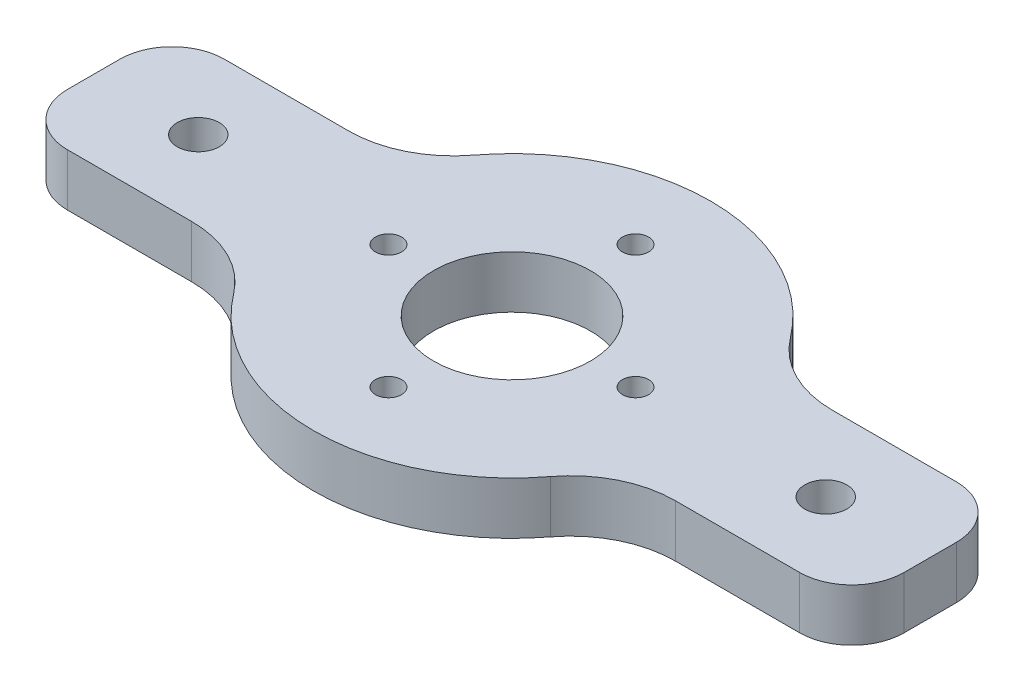
ISO-10303-21;
HEADER;
FILE_DESCRIPTION(('STEP AP214'),'2;1');
FILE_NAME('part.step','',(''),(''),'','','');
FILE_SCHEMA(('AUTOMOTIVE_DESIGN { 1 0 10303 214 1 1 1 1 }'));
ENDSEC;
DATA;
#1=APPLICATION_CONTEXT('core data for automotive mechanical design processes');
#2=APPLICATION_PROTOCOL_DEFINITION('international standard','automotive_design',2000,#1);
#3=PRODUCT_CONTEXT('',#1,'mechanical');
#4=PRODUCT('Part','Part','',(#3));
#5=PRODUCT_RELATED_PRODUCT_CATEGORY('part','',(#4));
#6=PRODUCT_DEFINITION_FORMATION('','',#4);
#7=PRODUCT_DEFINITION_CONTEXT('part definition',#1,'design');
#8=PRODUCT_DEFINITION('design','',#6,#7);
#9=PRODUCT_DEFINITION_SHAPE('','',#8);
#10=(LENGTH_UNIT() NAMED_UNIT(*) SI_UNIT(.MILLI.,.METRE.));
#11=(NAMED_UNIT(*) PLANE_ANGLE_UNIT() SI_UNIT($,.RADIAN.));
#12=(NAMED_UNIT(*) SI_UNIT($,.STERADIAN.) SOLID_ANGLE_UNIT());
#13=UNCERTAINTY_MEASURE_WITH_UNIT(LENGTH_MEASURE(1.E-05),#10,'distance_accuracy_value','');
#14=(GEOMETRIC_REPRESENTATION_CONTEXT(3) GLOBAL_UNCERTAINTY_ASSIGNED_CONTEXT((#13)) GLOBAL_UNIT_ASSIGNED_CONTEXT((#10,
#11,#12)) REPRESENTATION_CONTEXT('',''));
#15=CARTESIAN_POINT('',(0.,0.,0.));
#16=DIRECTION('',(0.,0.,1.));
#17=DIRECTION('',(1.,0.,0.));
#18=AXIS2_PLACEMENT_3D('',#15,#16,#17);
#19=CARTESIAN_POINT('',(0.,6.35,-9.525));
#20=DIRECTION('',(0.,0.,-1.));
#21=DIRECTION('',(-1.,0.,0.));
#22=AXIS2_PLACEMENT_3D('',#19,#20,#21);
#23=PLANE('',#22);
#24=DIRECTION('',(1.,0.,0.));
#25=VECTOR('',#24,1.);
#26=CARTESIAN_POINT('',(0.,0.,-9.525));
#27=LINE('',#26,#25);
#28=CARTESIAN_POINT('',(29.3683209428118,0.,-9.525));
#29=VERTEX_POINT('',#28);
#30=CARTESIAN_POINT('',(44.4499999999999,0.,-9.525));
#31=VERTEX_POINT('',#30);
#32=EDGE_CURVE('E220',#29,#31,#27,.T.);
#33=ORIENTED_EDGE('',*,*,#32,.F.);
#34=DIRECTION('',(0.,-1.,0.));
#35=VECTOR('',#34,1.);
#36=CARTESIAN_POINT('',(29.3683209428118,6.35,-9.525));
#37=LINE('',#36,#35);
#38=CARTESIAN_POINT('',(29.3683209428118,6.35,-9.525));
#39=VERTEX_POINT('',#38);
#40=EDGE_CURVE('E11',#39,#29,#37,.T.);
#41=ORIENTED_EDGE('',*,*,#40,.F.);
#42=DIRECTION('',(1.,0.,0.));
#43=VECTOR('',#42,1.);
#44=CARTESIAN_POINT('',(0.,6.35,-9.525));
#45=LINE('',#44,#43);
#46=CARTESIAN_POINT('',(44.4499999999999,6.35,-9.525));
#47=VERTEX_POINT('',#46);
#48=EDGE_CURVE('E303',#39,#47,#45,.T.);
#49=ORIENTED_EDGE('',*,*,#48,.T.);
#50=DIRECTION('',(0.,-1.,0.));
#51=VECTOR('',#50,1.);
#52=CARTESIAN_POINT('',(44.4499999999999,6.35,-9.525));
#53=LINE('',#52,#51);
#54=EDGE_CURVE('E60',#47,#31,#53,.T.);
#55=ORIENTED_EDGE('',*,*,#54,.T.);
#56=EDGE_LOOP('',(#33,#41,#49,#55));
#57=FACE_BOUND('',#56,.T.);
#58=ADVANCED_FACE('F43',(#57),#23,.T.);
#59=CARTESIAN_POINT('',(29.3683209428118,6.35,-22.225));
#60=DIRECTION('',(0.,-1.,0.));
#61=DIRECTION('',(0.,0.,-1.));
#62=AXIS2_PLACEMENT_3D('',#59,#60,#61);
#63=CYLINDRICAL_SURFACE('',#62,12.7);
#64=CARTESIAN_POINT('',(29.3683209428118,0.,-22.225));
#65=DIRECTION('',(0.,1.,0.));
#66=DIRECTION('',(0.,0.,1.));
#67=AXIS2_PLACEMENT_3D('',#64,#65,#66);
#68=CIRCLE('',#67,12.7);
#69=CARTESIAN_POINT('',(19.2413137211526,0.,-14.5612068965517));
#70=VERTEX_POINT('',#69);
#71=EDGE_CURVE('E223',#29,#70,#68,.F.);
#72=ORIENTED_EDGE('',*,*,#71,.T.);
#73=DIRECTION('',(0.,-1.,0.));
#74=VECTOR('',#73,1.);
#75=CARTESIAN_POINT('',(19.2413137211526,6.35,-14.5612068965517));
#76=LINE('',#75,#74);
#77=CARTESIAN_POINT('',(19.2413137211526,6.35,-14.5612068965517));
#78=VERTEX_POINT('',#77);
#79=EDGE_CURVE('E52',#78,#70,#76,.T.);
#80=ORIENTED_EDGE('',*,*,#79,.F.);
#81=CARTESIAN_POINT('',(29.3683209428118,6.35,-22.225));
#82=DIRECTION('',(0.,1.,0.));
#83=DIRECTION('',(0.,0.,1.));
#84=AXIS2_PLACEMENT_3D('',#81,#82,#83);
#85=CIRCLE('',#84,12.7);
#86=EDGE_CURVE('E373',#39,#78,#85,.F.);
#87=ORIENTED_EDGE('',*,*,#86,.F.);
#88=ORIENTED_EDGE('',*,*,#40,.T.);
#89=EDGE_LOOP('',(#72,#80,#87,#88));
#90=FACE_BOUND('',#89,.T.);
#91=ADVANCED_FACE('F422',(#90),#63,.F.);
#92=CARTESIAN_POINT('',(0.,6.35,0.));
#93=DIRECTION('',(0.,-1.,0.));
#94=DIRECTION('',(0.,0.,-1.));
#95=AXIS2_PLACEMENT_3D('',#92,#93,#94);
#96=CYLINDRICAL_SURFACE('',#95,24.13);
#97=CARTESIAN_POINT('',(0.,0.,0.));
#98=DIRECTION('',(0.,1.,0.));
#99=DIRECTION('',(0.,0.,1.));
#100=AXIS2_PLACEMENT_3D('',#97,#98,#99);
#101=CIRCLE('',#100,24.13);
#102=CARTESIAN_POINT('',(-19.2413137211526,0.,-14.5612068965517));
#103=VERTEX_POINT('',#102);
#104=EDGE_CURVE('E226',#70,#103,#101,.T.);
#105=ORIENTED_EDGE('',*,*,#104,.T.);
#106=DIRECTION('',(0.,-1.,0.));
#107=VECTOR('',#106,1.);
#108=CARTESIAN_POINT('',(-19.2413137211526,6.35,-14.5612068965517));
#109=LINE('',#108,#107);
#110=CARTESIAN_POINT('',(-19.2413137211526,6.35,-14.5612068965517));
#111=VERTEX_POINT('',#110);
#112=EDGE_CURVE('E340',#111,#103,#109,.T.);
#113=ORIENTED_EDGE('',*,*,#112,.F.);
#114=CARTESIAN_POINT('',(0.,6.35,0.));
#115=DIRECTION('',(0.,1.,0.));
#116=DIRECTION('',(0.,0.,1.));
#117=AXIS2_PLACEMENT_3D('',#114,#115,#116);
#118=CIRCLE('',#117,24.13);
#119=EDGE_CURVE('E350',#78,#111,#118,.T.);
#120=ORIENTED_EDGE('',*,*,#119,.F.);
#121=ORIENTED_EDGE('',*,*,#79,.T.);
#122=EDGE_LOOP('',(#105,#113,#120,#121));
#123=FACE_BOUND('',#122,.T.);
#124=ADVANCED_FACE('F348',(#123),#96,.T.);
#125=CARTESIAN_POINT('',(-29.3683209428118,6.35,-22.225));
#126=DIRECTION('',(0.,-1.,0.));
#127=DIRECTION('',(0.,0.,-1.));
#128=AXIS2_PLACEMENT_3D('',#125,#126,#127);
#129=CYLINDRICAL_SURFACE('',#128,12.7);
#130=CARTESIAN_POINT('',(-29.3683209428118,0.,-22.225));
#131=DIRECTION('',(0.,1.,0.));
#132=DIRECTION('',(0.,0.,1.));
#133=AXIS2_PLACEMENT_3D('',#130,#131,#132);
#134=CIRCLE('',#133,12.7);
#135=CARTESIAN_POINT('',(-29.3683209428118,0.,-9.525));
#136=VERTEX_POINT('',#135);
#137=EDGE_CURVE('E230',#136,#103,#134,.T.);
#138=ORIENTED_EDGE('',*,*,#137,.F.);
#139=DIRECTION('',(0.,-1.,0.));
#140=VECTOR('',#139,1.);
#141=CARTESIAN_POINT('',(-29.3683209428118,6.35,-9.525));
#142=LINE('',#141,#140);
#143=CARTESIAN_POINT('',(-29.3683209428118,6.35,-9.525));
#144=VERTEX_POINT('',#143);
#145=EDGE_CURVE('E337',#144,#136,#142,.T.);
#146=ORIENTED_EDGE('',*,*,#145,.F.);
#147=CARTESIAN_POINT('',(-29.3683209428118,6.35,-22.225));
#148=DIRECTION('',(0.,1.,0.));
#149=DIRECTION('',(0.,0.,1.));
#150=AXIS2_PLACEMENT_3D('',#147,#148,#149);
#151=CIRCLE('',#150,12.7);
#152=EDGE_CURVE('E363',#144,#111,#151,.T.);
#153=ORIENTED_EDGE('',*,*,#152,.T.);
#154=ORIENTED_EDGE('',*,*,#112,.T.);
#155=EDGE_LOOP('',(#138,#146,#153,#154));
#156=FACE_BOUND('',#155,.T.);
#157=ADVANCED_FACE('F360',(#156),#129,.F.);
#158=CARTESIAN_POINT('',(0.,6.35,-9.525));
#159=DIRECTION('',(0.,0.,-1.));
#160=DIRECTION('',(-1.,0.,0.));
#161=AXIS2_PLACEMENT_3D('',#158,#159,#160);
#162=PLANE('',#161);
#163=DIRECTION('',(1.,0.,0.));
#164=VECTOR('',#163,1.);
#165=CARTESIAN_POINT('',(0.,0.,-9.525));
#166=LINE('',#165,#164);
#167=CARTESIAN_POINT('',(-44.45,0.,-9.525));
#168=VERTEX_POINT('',#167);
#169=EDGE_CURVE('E234',#168,#136,#166,.T.);
#170=ORIENTED_EDGE('',*,*,#169,.F.);
#171=DIRECTION('',(0.,-1.,0.));
#172=VECTOR('',#171,1.);
#173=CARTESIAN_POINT('',(-44.45,6.35,-9.525));
#174=LINE('',#173,#172);
#175=CARTESIAN_POINT('',(-44.45,6.35,-9.525));
#176=VERTEX_POINT('',#175);
#177=EDGE_CURVE('E334',#176,#168,#174,.T.);
#178=ORIENTED_EDGE('',*,*,#177,.F.);
#179=DIRECTION('',(1.,0.,0.));
#180=VECTOR('',#179,1.);
#181=CARTESIAN_POINT('',(0.,6.35,-9.525));
#182=LINE('',#181,#180);
#183=EDGE_CURVE('E367',#176,#144,#182,.T.);
#184=ORIENTED_EDGE('',*,*,#183,.T.);
#185=ORIENTED_EDGE('',*,*,#145,.T.);
#186=EDGE_LOOP('',(#170,#178,#184,#185));
#187=FACE_BOUND('',#186,.T.);
#188=ADVANCED_FACE('F630',(#187),#162,.T.);
#189=CARTESIAN_POINT('',(-44.45,6.35,-3.175));
#190=DIRECTION('',(0.,-1.,0.));
#191=DIRECTION('',(0.,0.,-1.));
#192=AXIS2_PLACEMENT_3D('',#189,#190,#191);
#193=CYLINDRICAL_SURFACE('',#192,6.35);
#194=CARTESIAN_POINT('',(-44.45,0.,-3.175));
#195=DIRECTION('',(0.,1.,0.));
#196=DIRECTION('',(0.,0.,1.));
#197=AXIS2_PLACEMENT_3D('',#194,#195,#196);
#198=CIRCLE('',#197,6.35);
#199=CARTESIAN_POINT('',(-50.8,0.,-3.17499999999996));
#200=VERTEX_POINT('',#199);
#201=EDGE_CURVE('E238',#168,#200,#198,.T.);
#202=ORIENTED_EDGE('',*,*,#201,.T.);
#203=DIRECTION('',(0.,-1.,0.));
#204=VECTOR('',#203,1.);
#205=CARTESIAN_POINT('',(-50.8,6.35,-3.17499999999996));
#206=LINE('',#205,#204);
#207=CARTESIAN_POINT('',(-50.8,6.35,-3.17499999999996));
#208=VERTEX_POINT('',#207);
#209=EDGE_CURVE('E330',#208,#200,#206,.T.);
#210=ORIENTED_EDGE('',*,*,#209,.F.);
#211=CARTESIAN_POINT('',(-44.45,6.35,-3.175));
#212=DIRECTION('',(0.,1.,0.));
#213=DIRECTION('',(0.,0.,1.));
#214=AXIS2_PLACEMENT_3D('',#211,#212,#213);
#215=CIRCLE('',#214,6.35);
#216=EDGE_CURVE('E371',#176,#208,#215,.T.);
#217=ORIENTED_EDGE('',*,*,#216,.F.);
#218=ORIENTED_EDGE('',*,*,#177,.T.);
#219=EDGE_LOOP('',(#202,#210,#217,#218));
#220=FACE_BOUND('',#219,.T.);
#221=ADVANCED_FACE('F619',(#220),#193,.T.);
#222=CARTESIAN_POINT('',(-50.8,6.35,0.));
#223=DIRECTION('',(1.,0.,0.));
#224=DIRECTION('',(0.,0.,-1.));
#225=AXIS2_PLACEMENT_3D('',#222,#223,#224);
#226=PLANE('',#225);
#227=DIRECTION('',(0.,0.,1.));
#228=VECTOR('',#227,1.);
#229=CARTESIAN_POINT('',(-50.8,0.,0.));
#230=LINE('',#229,#228);
#231=CARTESIAN_POINT('',(-50.8,0.,3.17499999999996));
#232=VERTEX_POINT('',#231);
#233=EDGE_CURVE('E241',#200,#232,#230,.T.);
#234=ORIENTED_EDGE('',*,*,#233,.T.);
#235=DIRECTION('',(0.,-1.,0.));
#236=VECTOR('',#235,1.);
#237=CARTESIAN_POINT('',(-50.8,6.35,3.17499999999996));
#238=LINE('',#237,#236);
#239=CARTESIAN_POINT('',(-50.8,6.35,3.17499999999996));
#240=VERTEX_POINT('',#239);
#241=EDGE_CURVE('E327',#240,#232,#238,.T.);
#242=ORIENTED_EDGE('',*,*,#241,.F.);
#243=DIRECTION('',(0.,0.,1.));
#244=VECTOR('',#243,1.);
#245=CARTESIAN_POINT('',(-50.8,6.35,0.));
#246=LINE('',#245,#244);
#247=EDGE_CURVE('E379',#208,#240,#246,.T.);
#248=ORIENTED_EDGE('',*,*,#247,.F.);
#249=ORIENTED_EDGE('',*,*,#209,.T.);
#250=EDGE_LOOP('',(#234,#242,#248,#249));
#251=FACE_BOUND('',#250,.T.);
#252=ADVANCED_FACE('F608',(#251),#226,.F.);
#253=CARTESIAN_POINT('',(-44.45,6.35,3.175));
#254=DIRECTION('',(0.,-1.,0.));
#255=DIRECTION('',(0.,0.,-1.));
#256=AXIS2_PLACEMENT_3D('',#253,#254,#255);
#257=CYLINDRICAL_SURFACE('',#256,6.35);
#258=CARTESIAN_POINT('',(-44.45,0.,3.175));
#259=DIRECTION('',(0.,1.,0.));
#260=DIRECTION('',(0.,0.,1.));
#261=AXIS2_PLACEMENT_3D('',#258,#259,#260);
#262=CIRCLE('',#261,6.35);
#263=CARTESIAN_POINT('',(-44.45,0.,9.525));
#264=VERTEX_POINT('',#263);
#265=EDGE_CURVE('E245',#264,#232,#262,.F.);
#266=ORIENTED_EDGE('',*,*,#265,.F.);
#267=DIRECTION('',(0.,-1.,0.));
#268=VECTOR('',#267,1.);
#269=CARTESIAN_POINT('',(-44.45,6.35,9.525));
#270=LINE('',#269,#268);
#271=CARTESIAN_POINT('',(-44.45,6.35,9.525));
#272=VERTEX_POINT('',#271);
#273=EDGE_CURVE('E324',#272,#264,#270,.T.);
#274=ORIENTED_EDGE('',*,*,#273,.F.);
#275=CARTESIAN_POINT('',(-44.45,6.35,3.175));
#276=DIRECTION('',(0.,1.,0.));
#277=DIRECTION('',(0.,0.,1.));
#278=AXIS2_PLACEMENT_3D('',#275,#276,#277);
#279=CIRCLE('',#278,6.35);
#280=EDGE_CURVE('E382',#272,#240,#279,.F.);
#281=ORIENTED_EDGE('',*,*,#280,.T.);
#282=ORIENTED_EDGE('',*,*,#241,.T.);
#283=EDGE_LOOP('',(#266,#274,#281,#282));
#284=FACE_BOUND('',#283,.T.);
#285=ADVANCED_FACE('F597',(#284),#257,.T.);
#286=CARTESIAN_POINT('',(0.,6.35,9.525));
#287=DIRECTION('',(0.,0.,-1.));
#288=DIRECTION('',(-1.,0.,0.));
#289=AXIS2_PLACEMENT_3D('',#286,#287,#288);
#290=PLANE('',#289);
#291=DIRECTION('',(1.,0.,0.));
#292=VECTOR('',#291,1.);
#293=CARTESIAN_POINT('',(0.,0.,9.525));
#294=LINE('',#293,#292);
#295=CARTESIAN_POINT('',(-29.3683209428118,0.,9.525));
#296=VERTEX_POINT('',#295);
#297=EDGE_CURVE('E249',#264,#296,#294,.T.);
#298=ORIENTED_EDGE('',*,*,#297,.T.);
#299=DIRECTION('',(0.,-1.,0.));
#300=VECTOR('',#299,1.);
#301=CARTESIAN_POINT('',(-29.3683209428118,6.35,9.525));
#302=LINE('',#301,#300);
#303=CARTESIAN_POINT('',(-29.3683209428118,6.35,9.525));
#304=VERTEX_POINT('',#303);
#305=EDGE_CURVE('E320',#304,#296,#302,.T.);
#306=ORIENTED_EDGE('',*,*,#305,.F.);
#307=DIRECTION('',(1.,0.,0.));
#308=VECTOR('',#307,1.);
#309=CARTESIAN_POINT('',(0.,6.35,9.525));
#310=LINE('',#309,#308);
#311=EDGE_CURVE('E386',#272,#304,#310,.T.);
#312=ORIENTED_EDGE('',*,*,#311,.F.);
#313=ORIENTED_EDGE('',*,*,#273,.T.);
#314=EDGE_LOOP('',(#298,#306,#312,#313));
#315=FACE_BOUND('',#314,.T.);
#316=ADVANCED_FACE('F586',(#315),#290,.F.);
#317=CARTESIAN_POINT('',(-29.3683209428118,6.35,22.225));
#318=DIRECTION('',(0.,-1.,0.));
#319=DIRECTION('',(0.,0.,-1.));
#320=AXIS2_PLACEMENT_3D('',#317,#318,#319);
#321=CYLINDRICAL_SURFACE('',#320,12.7);
#322=CARTESIAN_POINT('',(-29.3683209428118,0.,22.225));
#323=DIRECTION('',(0.,1.,0.));
#324=DIRECTION('',(0.,0.,1.));
#325=AXIS2_PLACEMENT_3D('',#322,#323,#324);
#326=CIRCLE('',#325,12.7);
#327=CARTESIAN_POINT('',(-19.2413137211526,0.,14.5612068965517));
#328=VERTEX_POINT('',#327);
#329=EDGE_CURVE('E252',#296,#328,#326,.F.);
#330=ORIENTED_EDGE('',*,*,#329,.T.);
#331=DIRECTION('',(0.,-1.,0.));
#332=VECTOR('',#331,1.);
#333=CARTESIAN_POINT('',(-19.2413137211526,6.35,14.5612068965517));
#334=LINE('',#333,#332);
#335=CARTESIAN_POINT('',(-19.2413137211526,6.35,14.5612068965517));
#336=VERTEX_POINT('',#335);
#337=EDGE_CURVE('E316',#336,#328,#334,.T.);
#338=ORIENTED_EDGE('',*,*,#337,.F.);
#339=CARTESIAN_POINT('',(-29.3683209428118,6.35,22.225));
#340=DIRECTION('',(0.,1.,0.));
#341=DIRECTION('',(0.,0.,1.));
#342=AXIS2_PLACEMENT_3D('',#339,#340,#341);
#343=CIRCLE('',#342,12.7);
#344=EDGE_CURVE('E389',#304,#336,#343,.F.);
#345=ORIENTED_EDGE('',*,*,#344,.F.);
#346=ORIENTED_EDGE('',*,*,#305,.T.);
#347=EDGE_LOOP('',(#330,#338,#345,#346));
#348=FACE_BOUND('',#347,.T.);
#349=ADVANCED_FACE('F576',(#348),#321,.F.);
#350=CARTESIAN_POINT('',(0.,6.35,0.));
#351=DIRECTION('',(0.,-1.,0.));
#352=DIRECTION('',(0.,0.,-1.));
#353=AXIS2_PLACEMENT_3D('',#350,#351,#352);
#354=CYLINDRICAL_SURFACE('',#353,24.13);
#355=CARTESIAN_POINT('',(0.,0.,0.));
#356=DIRECTION('',(0.,1.,0.));
#357=DIRECTION('',(0.,0.,1.));
#358=AXIS2_PLACEMENT_3D('',#355,#356,#357);
#359=CIRCLE('',#358,24.13);
#360=CARTESIAN_POINT('',(19.2413137211526,0.,14.5612068965517));
#361=VERTEX_POINT('',#360);
#362=EDGE_CURVE('E255',#328,#361,#359,.T.);
#363=ORIENTED_EDGE('',*,*,#362,.T.);
#364=DIRECTION('',(0.,-1.,0.));
#365=VECTOR('',#364,1.);
#366=CARTESIAN_POINT('',(19.2413137211526,6.35,14.5612068965517));
#367=LINE('',#366,#365);
#368=CARTESIAN_POINT('',(19.2413137211526,6.35,14.5612068965517));
#369=VERTEX_POINT('',#368);
#370=EDGE_CURVE('E313',#369,#361,#367,.T.);
#371=ORIENTED_EDGE('',*,*,#370,.F.);
#372=CARTESIAN_POINT('',(0.,6.35,0.));
#373=DIRECTION('',(0.,1.,0.));
#374=DIRECTION('',(0.,0.,1.));
#375=AXIS2_PLACEMENT_3D('',#372,#373,#374);
#376=CIRCLE('',#375,24.13);
#377=EDGE_CURVE('E392',#336,#369,#376,.T.);
#378=ORIENTED_EDGE('',*,*,#377,.F.);
#379=ORIENTED_EDGE('',*,*,#337,.T.);
#380=EDGE_LOOP('',(#363,#371,#378,#379));
#381=FACE_BOUND('',#380,.T.);
#382=ADVANCED_FACE('F407',(#381),#354,.T.);
#383=CARTESIAN_POINT('',(29.3683209428118,6.35,22.225));
#384=DIRECTION('',(0.,-1.,0.));
#385=DIRECTION('',(0.,0.,-1.));
#386=AXIS2_PLACEMENT_3D('',#383,#384,#385);
#387=CYLINDRICAL_SURFACE('',#386,12.7);
#388=CARTESIAN_POINT('',(29.3683209428118,0.,22.225));
#389=DIRECTION('',(0.,1.,0.));
#390=DIRECTION('',(0.,0.,1.));
#391=AXIS2_PLACEMENT_3D('',#388,#389,#390);
#392=CIRCLE('',#391,12.7);
#393=CARTESIAN_POINT('',(29.3683209428118,0.,9.525));
#394=VERTEX_POINT('',#393);
#395=EDGE_CURVE('E259',#394,#361,#392,.T.);
#396=ORIENTED_EDGE('',*,*,#395,.F.);
#397=DIRECTION('',(0.,-1.,0.));
#398=VECTOR('',#397,1.);
#399=CARTESIAN_POINT('',(29.3683209428118,6.35,9.525));
#400=LINE('',#399,#398);
#401=CARTESIAN_POINT('',(29.3683209428118,6.35,9.525));
#402=VERTEX_POINT('',#401);
#403=EDGE_CURVE('E310',#402,#394,#400,.T.);
#404=ORIENTED_EDGE('',*,*,#403,.F.);
#405=CARTESIAN_POINT('',(29.3683209428118,6.35,22.225));
#406=DIRECTION('',(0.,1.,0.));
#407=DIRECTION('',(0.,0.,1.));
#408=AXIS2_PLACEMENT_3D('',#405,#406,#407);
#409=CIRCLE('',#408,12.7);
#410=EDGE_CURVE('E395',#402,#369,#409,.T.);
#411=ORIENTED_EDGE('',*,*,#410,.T.);
#412=ORIENTED_EDGE('',*,*,#370,.T.);
#413=EDGE_LOOP('',(#396,#404,#411,#412));
#414=FACE_BOUND('',#413,.T.);
#415=ADVANCED_FACE('F401',(#414),#387,.F.);
#416=CARTESIAN_POINT('',(0.,6.35,9.525));
#417=DIRECTION('',(0.,0.,-1.));
#418=DIRECTION('',(-1.,0.,0.));
#419=AXIS2_PLACEMENT_3D('',#416,#417,#418);
#420=PLANE('',#419);
#421=DIRECTION('',(1.,0.,0.));
#422=VECTOR('',#421,1.);
#423=CARTESIAN_POINT('',(0.,0.,9.525));
#424=LINE('',#423,#422);
#425=CARTESIAN_POINT('',(44.4499999999999,0.,9.525));
#426=VERTEX_POINT('',#425);
#427=EDGE_CURVE('E263',#394,#426,#424,.T.);
#428=ORIENTED_EDGE('',*,*,#427,.T.);
#429=DIRECTION('',(0.,-1.,0.));
#430=VECTOR('',#429,1.);
#431=CARTESIAN_POINT('',(44.4499999999999,6.35,9.525));
#432=LINE('',#431,#430);
#433=CARTESIAN_POINT('',(44.4499999999999,6.35,9.525));
#434=VERTEX_POINT('',#433);
#435=EDGE_CURVE('E182',#434,#426,#432,.T.);
#436=ORIENTED_EDGE('',*,*,#435,.F.);
#437=DIRECTION('',(1.,0.,0.));
#438=VECTOR('',#437,1.);
#439=CARTESIAN_POINT('',(0.,6.35,9.525));
#440=LINE('',#439,#438);
#441=EDGE_CURVE('E168',#402,#434,#440,.T.);
#442=ORIENTED_EDGE('',*,*,#441,.F.);
#443=ORIENTED_EDGE('',*,*,#403,.T.);
#444=EDGE_LOOP('',(#428,#436,#442,#443));
#445=FACE_BOUND('',#444,.T.);
#446=ADVANCED_FACE('F412',(#445),#420,.F.);
#447=CARTESIAN_POINT('',(44.45,6.35,3.175));
#448=DIRECTION('',(0.,-1.,0.));
#449=DIRECTION('',(0.,0.,-1.));
#450=AXIS2_PLACEMENT_3D('',#447,#448,#449);
#451=CYLINDRICAL_SURFACE('',#450,6.35);
#452=CARTESIAN_POINT('',(44.45,0.,3.175));
#453=DIRECTION('',(0.,1.,0.));
#454=DIRECTION('',(0.,0.,1.));
#455=AXIS2_PLACEMENT_3D('',#452,#453,#454);
#456=CIRCLE('',#455,6.35);
#457=CARTESIAN_POINT('',(50.8,0.,3.17499999999996));
#458=VERTEX_POINT('',#457);
#459=EDGE_CURVE('E178',#426,#458,#456,.T.);
#460=ORIENTED_EDGE('',*,*,#459,.T.);
#461=DIRECTION('',(0.,-1.,0.));
#462=VECTOR('',#461,1.);
#463=CARTESIAN_POINT('',(50.8,6.35,3.17499999999996));
#464=LINE('',#463,#462);
#465=CARTESIAN_POINT('',(50.8,6.35,3.17499999999996));
#466=VERTEX_POINT('',#465);
#467=EDGE_CURVE('E175',#466,#458,#464,.T.);
#468=ORIENTED_EDGE('',*,*,#467,.F.);
#469=CARTESIAN_POINT('',(44.45,6.35,3.175));
#470=DIRECTION('',(0.,1.,0.));
#471=DIRECTION('',(0.,0.,1.));
#472=AXIS2_PLACEMENT_3D('',#469,#470,#471);
#473=CIRCLE('',#472,6.35);
#474=EDGE_CURVE('E158',#434,#466,#473,.T.);
#475=ORIENTED_EDGE('',*,*,#474,.F.);
#476=ORIENTED_EDGE('',*,*,#435,.T.);
#477=EDGE_LOOP('',(#460,#468,#475,#476));
#478=FACE_BOUND('',#477,.T.);
#479=ADVANCED_FACE('F176',(#478),#451,.T.);
#480=CARTESIAN_POINT('',(50.8,6.35,0.));
#481=DIRECTION('',(1.,0.,0.));
#482=DIRECTION('',(0.,0.,-1.));
#483=AXIS2_PLACEMENT_3D('',#480,#481,#482);
#484=PLANE('',#483);
#485=DIRECTION('',(0.,0.,1.));
#486=VECTOR('',#485,1.);
#487=CARTESIAN_POINT('',(50.8,0.,0.));
#488=LINE('',#487,#486);
#489=CARTESIAN_POINT('',(50.8,0.,-3.17499999999996));
#490=VERTEX_POINT('',#489);
#491=EDGE_CURVE('E268',#490,#458,#488,.T.);
#492=ORIENTED_EDGE('',*,*,#491,.F.);
#493=DIRECTION('',(0.,-1.,0.));
#494=VECTOR('',#493,1.);
#495=CARTESIAN_POINT('',(50.8,6.35,-3.17499999999996));
#496=LINE('',#495,#494);
#497=CARTESIAN_POINT('',(50.8,6.35,-3.17499999999996));
#498=VERTEX_POINT('',#497);
#499=EDGE_CURVE('E109',#498,#490,#496,.T.);
#500=ORIENTED_EDGE('',*,*,#499,.F.);
#501=DIRECTION('',(0.,0.,1.));
#502=VECTOR('',#501,1.);
#503=CARTESIAN_POINT('',(50.8,6.35,0.));
#504=LINE('',#503,#502);
#505=EDGE_CURVE('E165',#498,#466,#504,.T.);
#506=ORIENTED_EDGE('',*,*,#505,.T.);
#507=ORIENTED_EDGE('',*,*,#467,.T.);
#508=EDGE_LOOP('',(#492,#500,#506,#507));
#509=FACE_BOUND('',#508,.T.);
#510=ADVANCED_FACE('F184',(#509),#484,.T.);
#511=CARTESIAN_POINT('',(15.,6.35,0.));
#512=DIRECTION('',(0.,-1.,0.));
#513=DIRECTION('',(0.,0.,-1.));
#514=AXIS2_PLACEMENT_3D('',#511,#512,#513);
#515=CYLINDRICAL_SURFACE('',#514,1.5875);
#516=CARTESIAN_POINT('',(15.,6.35,0.));
#517=DIRECTION('',(0.,1.,0.));
#518=DIRECTION('',(0.,0.,1.));
#519=AXIS2_PLACEMENT_3D('',#516,#517,#518);
#520=CIRCLE('',#519,1.5875);
#521=CARTESIAN_POINT('',(15.,6.35,1.5875));
#522=VERTEX_POINT('',#521);
#523=EDGE_CURVE('E212',#522,#522,#520,.T.);
#524=ORIENTED_EDGE('',*,*,#523,.T.);
#525=EDGE_LOOP('',(#524));
#526=FACE_BOUND('',#525,.T.);
#527=CARTESIAN_POINT('',(15.,0.,0.));
#528=DIRECTION('',(0.,1.,0.));
#529=DIRECTION('',(0.,0.,1.));
#530=AXIS2_PLACEMENT_3D('',#527,#528,#529);
#531=CIRCLE('',#530,1.5875);
#532=CARTESIAN_POINT('',(15.,0.,1.5875));
#533=VERTEX_POINT('',#532);
#534=EDGE_CURVE('E295',#533,#533,#531,.T.);
#535=ORIENTED_EDGE('',*,*,#534,.F.);
#536=EDGE_LOOP('',(#535));
#537=FACE_BOUND('',#536,.T.);
#538=ADVANCED_FACE('F443',(#526,#537),#515,.F.);
#539=CARTESIAN_POINT('',(0.,6.35,-15.));
#540=DIRECTION('',(0.,-1.,0.));
#541=DIRECTION('',(0.,0.,-1.));
#542=AXIS2_PLACEMENT_3D('',#539,#540,#541);
#543=CYLINDRICAL_SURFACE('',#542,1.5875);
#544=CARTESIAN_POINT('',(0.,6.35,-15.));
#545=DIRECTION('',(0.,1.,0.));
#546=DIRECTION('',(0.,0.,1.));
#547=AXIS2_PLACEMENT_3D('',#544,#545,#546);
#548=CIRCLE('',#547,1.5875);
#549=CARTESIAN_POINT('',(0.,6.35,-13.4125));
#550=VERTEX_POINT('',#549);
#551=EDGE_CURVE('E208',#550,#550,#548,.T.);
#552=ORIENTED_EDGE('',*,*,#551,.T.);
#553=EDGE_LOOP('',(#552));
#554=FACE_BOUND('',#553,.T.);
#555=CARTESIAN_POINT('',(0.,0.,-15.));
#556=DIRECTION('',(0.,1.,0.));
#557=DIRECTION('',(0.,0.,1.));
#558=AXIS2_PLACEMENT_3D('',#555,#556,#557);
#559=CIRCLE('',#558,1.5875);
#560=CARTESIAN_POINT('',(0.,0.,-13.4125));
#561=VERTEX_POINT('',#560);
#562=EDGE_CURVE('E291',#561,#561,#559,.T.);
#563=ORIENTED_EDGE('',*,*,#562,.F.);
#564=EDGE_LOOP('',(#563));
#565=FACE_BOUND('',#564,.T.);
#566=ADVANCED_FACE('F447',(#554,#565),#543,.F.);
#567=CARTESIAN_POINT('',(-38.1,6.35,0.));
#568=DIRECTION('',(0.,-1.,0.));
#569=DIRECTION('',(0.,0.,-1.));
#570=AXIS2_PLACEMENT_3D('',#567,#568,#569);
#571=CYLINDRICAL_SURFACE('',#570,2.5527);
#572=CARTESIAN_POINT('',(-38.1,6.35,0.));
#573=DIRECTION('',(0.,1.,0.));
#574=DIRECTION('',(0.,0.,1.));
#575=AXIS2_PLACEMENT_3D('',#572,#573,#574);
#576=CIRCLE('',#575,2.5527);
#577=CARTESIAN_POINT('',(-38.1,6.35,2.5527));
#578=VERTEX_POINT('',#577);
#579=EDGE_CURVE('E204',#578,#578,#576,.T.);
#580=ORIENTED_EDGE('',*,*,#579,.T.);
#581=EDGE_LOOP('',(#580));
#582=FACE_BOUND('',#581,.T.);
#583=CARTESIAN_POINT('',(-38.1,0.,0.));
#584=DIRECTION('',(0.,1.,0.));
#585=DIRECTION('',(0.,0.,1.));
#586=AXIS2_PLACEMENT_3D('',#583,#584,#585);
#587=CIRCLE('',#586,2.5527);
#588=CARTESIAN_POINT('',(-38.1,0.,2.5527));
#589=VERTEX_POINT('',#588);
#590=EDGE_CURVE('E287',#589,#589,#587,.T.);
#591=ORIENTED_EDGE('',*,*,#590,.F.);
#592=EDGE_LOOP('',(#591));
#593=FACE_BOUND('',#592,.T.);
#594=ADVANCED_FACE('F453',(#582,#593),#571,.F.);
#595=CARTESIAN_POINT('',(0.,6.35,15.));
#596=DIRECTION('',(0.,-1.,0.));
#597=DIRECTION('',(0.,0.,-1.));
#598=AXIS2_PLACEMENT_3D('',#595,#596,#597);
#599=CYLINDRICAL_SURFACE('',#598,1.5875);
#600=CARTESIAN_POINT('',(0.,6.35,15.));
#601=DIRECTION('',(0.,1.,0.));
#602=DIRECTION('',(0.,0.,1.));
#603=AXIS2_PLACEMENT_3D('',#600,#601,#602);
#604=CIRCLE('',#603,1.5875);
#605=CARTESIAN_POINT('',(0.,6.35,16.5875));
#606=VERTEX_POINT('',#605);
#607=EDGE_CURVE('E200',#606,#606,#604,.T.);
#608=ORIENTED_EDGE('',*,*,#607,.T.);
#609=EDGE_LOOP('',(#608));
#610=FACE_BOUND('',#609,.T.);
#611=CARTESIAN_POINT('',(0.,0.,15.));
#612=DIRECTION('',(0.,1.,0.));
#613=DIRECTION('',(0.,0.,1.));
#614=AXIS2_PLACEMENT_3D('',#611,#612,#613);
#615=CIRCLE('',#614,1.5875);
#616=CARTESIAN_POINT('',(0.,0.,16.5875));
#617=VERTEX_POINT('',#616);
#618=EDGE_CURVE('E283',#617,#617,#615,.T.);
#619=ORIENTED_EDGE('',*,*,#618,.F.);
#620=EDGE_LOOP('',(#619));
#621=FACE_BOUND('',#620,.T.);
#622=ADVANCED_FACE('F461',(#610,#621),#599,.F.);
#623=CARTESIAN_POINT('',(0.,6.35,0.));
#624=DIRECTION('',(0.,-1.,0.));
#625=DIRECTION('',(0.,0.,-1.));
#626=AXIS2_PLACEMENT_3D('',#623,#624,#625);
#627=CYLINDRICAL_SURFACE('',#626,9.525);
#628=CARTESIAN_POINT('',(0.,6.35,0.));
#629=DIRECTION('',(0.,1.,0.));
#630=DIRECTION('',(0.,0.,1.));
#631=AXIS2_PLACEMENT_3D('',#628,#629,#630);
#632=CIRCLE('',#631,9.525);
#633=CARTESIAN_POINT('',(0.,6.35,9.525));
#634=VERTEX_POINT('',#633);
#635=EDGE_CURVE('E196',#634,#634,#632,.T.);
#636=ORIENTED_EDGE('',*,*,#635,.T.);
#637=EDGE_LOOP('',(#636));
#638=FACE_BOUND('',#637,.T.);
#639=CARTESIAN_POINT('',(0.,0.,0.));
#640=DIRECTION('',(0.,1.,0.));
#641=DIRECTION('',(0.,0.,1.));
#642=AXIS2_PLACEMENT_3D('',#639,#640,#641);
#643=CIRCLE('',#642,9.525);
#644=CARTESIAN_POINT('',(0.,0.,9.525));
#645=VERTEX_POINT('',#644);
#646=EDGE_CURVE('E279',#645,#645,#643,.T.);
#647=ORIENTED_EDGE('',*,*,#646,.F.);
#648=EDGE_LOOP('',(#647));
#649=FACE_BOUND('',#648,.T.);
#650=ADVANCED_FACE('F437',(#638,#649),#627,.F.);
#651=CARTESIAN_POINT('',(-15.,6.35,0.));
#652=DIRECTION('',(0.,-1.,0.));
#653=DIRECTION('',(0.,0.,-1.));
#654=AXIS2_PLACEMENT_3D('',#651,#652,#653);
#655=CYLINDRICAL_SURFACE('',#654,1.5875);
#656=CARTESIAN_POINT('',(-15.,6.35,0.));
#657=DIRECTION('',(0.,1.,0.));
#658=DIRECTION('',(0.,0.,1.));
#659=AXIS2_PLACEMENT_3D('',#656,#657,#658);
#660=CIRCLE('',#659,1.5875);
#661=CARTESIAN_POINT('',(-15.,6.35,1.5875));
#662=VERTEX_POINT('',#661);
#663=EDGE_CURVE('E189',#662,#662,#660,.T.);
#664=ORIENTED_EDGE('',*,*,#663,.T.);
#665=EDGE_LOOP('',(#664));
#666=FACE_BOUND('',#665,.T.);
#667=CARTESIAN_POINT('',(-15.,0.,0.));
#668=DIRECTION('',(0.,1.,0.));
#669=DIRECTION('',(0.,0.,1.));
#670=AXIS2_PLACEMENT_3D('',#667,#668,#669);
#671=CIRCLE('',#670,1.5875);
#672=CARTESIAN_POINT('',(-15.,0.,1.5875));
#673=VERTEX_POINT('',#672);
#674=EDGE_CURVE('E275',#673,#673,#671,.T.);
#675=ORIENTED_EDGE('',*,*,#674,.F.);
#676=EDGE_LOOP('',(#675));
#677=FACE_BOUND('',#676,.T.);
#678=ADVANCED_FACE('F429',(#666,#677),#655,.F.);
#679=CARTESIAN_POINT('',(44.45,6.35,-3.175));
#680=DIRECTION('',(0.,-1.,0.));
#681=DIRECTION('',(0.,0.,-1.));
#682=AXIS2_PLACEMENT_3D('',#679,#680,#681);
#683=CYLINDRICAL_SURFACE('',#682,6.35);
#684=CARTESIAN_POINT('',(44.45,0.,-3.175));
#685=DIRECTION('',(0.,1.,0.));
#686=DIRECTION('',(0.,0.,1.));
#687=AXIS2_PLACEMENT_3D('',#684,#685,#686);
#688=CIRCLE('',#687,6.35);
#689=EDGE_CURVE('E271',#31,#490,#688,.F.);
#690=ORIENTED_EDGE('',*,*,#689,.F.);
#691=ORIENTED_EDGE('',*,*,#54,.F.);
#692=CARTESIAN_POINT('',(44.45,6.35,-3.175));
#693=DIRECTION('',(0.,1.,0.));
#694=DIRECTION('',(0.,0.,1.));
#695=AXIS2_PLACEMENT_3D('',#692,#693,#694);
#696=CIRCLE('',#695,6.35);
#697=EDGE_CURVE('E186',#47,#498,#696,.F.);
#698=ORIENTED_EDGE('',*,*,#697,.T.);
#699=ORIENTED_EDGE('',*,*,#499,.T.);
#700=EDGE_LOOP('',(#690,#691,#698,#699));
#701=FACE_BOUND('',#700,.T.);
#702=ADVANCED_FACE('F426',(#701),#683,.T.);
#703=CARTESIAN_POINT('',(38.1,6.35,0.));
#704=DIRECTION('',(0.,-1.,0.));
#705=DIRECTION('',(0.,0.,-1.));
#706=AXIS2_PLACEMENT_3D('',#703,#704,#705);
#707=CYLINDRICAL_SURFACE('',#706,2.5527);
#708=CARTESIAN_POINT('',(38.1,6.35,0.));
#709=DIRECTION('',(0.,1.,0.));
#710=DIRECTION('',(0.,0.,1.));
#711=AXIS2_PLACEMENT_3D('',#708,#709,#710);
#712=CIRCLE('',#711,2.5527);
#713=CARTESIAN_POINT('',(38.1,6.35,2.55269999999999));
#714=VERTEX_POINT('',#713);
#715=EDGE_CURVE('E216',#714,#714,#712,.F.);
#716=ORIENTED_EDGE('',*,*,#715,.F.);
#717=EDGE_LOOP('',(#716));
#718=FACE_BOUND('',#717,.T.);
#719=CARTESIAN_POINT('',(38.1,0.,0.));
#720=DIRECTION('',(0.,1.,0.));
#721=DIRECTION('',(0.,0.,1.));
#722=AXIS2_PLACEMENT_3D('',#719,#720,#721);
#723=CIRCLE('',#722,2.5527);
#724=CARTESIAN_POINT('',(38.1,0.,2.55269999999999));
#725=VERTEX_POINT('',#724);
#726=EDGE_CURVE('E299',#725,#725,#723,.F.);
#727=ORIENTED_EDGE('',*,*,#726,.T.);
#728=EDGE_LOOP('',(#727));
#729=FACE_BOUND('',#728,.T.);
#730=ADVANCED_FACE('F428',(#718,#729),#707,.F.);
#731=CARTESIAN_POINT('',(0.,6.35,0.));
#732=DIRECTION('',(0.,1.,0.));
#733=DIRECTION('',(0.,0.,1.));
#734=AXIS2_PLACEMENT_3D('',#731,#732,#733);
#735=PLANE('',#734);
#736=ORIENTED_EDGE('',*,*,#48,.F.);
#737=ORIENTED_EDGE('',*,*,#86,.T.);
#738=ORIENTED_EDGE('',*,*,#119,.T.);
#739=ORIENTED_EDGE('',*,*,#152,.F.);
#740=ORIENTED_EDGE('',*,*,#183,.F.);
#741=ORIENTED_EDGE('',*,*,#216,.T.);
#742=ORIENTED_EDGE('',*,*,#247,.T.);
#743=ORIENTED_EDGE('',*,*,#280,.F.);
#744=ORIENTED_EDGE('',*,*,#311,.T.);
#745=ORIENTED_EDGE('',*,*,#344,.T.);
#746=ORIENTED_EDGE('',*,*,#377,.T.);
#747=ORIENTED_EDGE('',*,*,#410,.F.);
#748=ORIENTED_EDGE('',*,*,#441,.T.);
#749=ORIENTED_EDGE('',*,*,#474,.T.);
#750=ORIENTED_EDGE('',*,*,#505,.F.);
#751=ORIENTED_EDGE('',*,*,#697,.F.);
#752=EDGE_LOOP('',(#736,#737,#738,#739,#740,#741,#742,#743,#744,#745,#746,#747,#748,#749,#750,#751));
#753=FACE_BOUND('',#752,.T.);
#754=ORIENTED_EDGE('',*,*,#663,.F.);
#755=EDGE_LOOP('',(#754));
#756=FACE_BOUND('',#755,.T.);
#757=ORIENTED_EDGE('',*,*,#635,.F.);
#758=EDGE_LOOP('',(#757));
#759=FACE_BOUND('',#758,.T.);
#760=ORIENTED_EDGE('',*,*,#607,.F.);
#761=EDGE_LOOP('',(#760));
#762=FACE_BOUND('',#761,.T.);
#763=ORIENTED_EDGE('',*,*,#579,.F.);
#764=EDGE_LOOP('',(#763));
#765=FACE_BOUND('',#764,.T.);
#766=ORIENTED_EDGE('',*,*,#551,.F.);
#767=EDGE_LOOP('',(#766));
#768=FACE_BOUND('',#767,.T.);
#769=ORIENTED_EDGE('',*,*,#523,.F.);
#770=EDGE_LOOP('',(#769));
#771=FACE_BOUND('',#770,.T.);
#772=ORIENTED_EDGE('',*,*,#715,.T.);
#773=EDGE_LOOP('',(#772));
#774=FACE_BOUND('',#773,.T.);
#775=ADVANCED_FACE('F161',(#753,#756,#759,#762,#765,#768,#771,#774),#735,.T.);
#776=CARTESIAN_POINT('',(0.,0.,0.));
#777=DIRECTION('',(0.,1.,0.));
#778=DIRECTION('',(0.,0.,1.));
#779=AXIS2_PLACEMENT_3D('',#776,#777,#778);
#780=PLANE('',#779);
#781=ORIENTED_EDGE('',*,*,#32,.T.);
#782=ORIENTED_EDGE('',*,*,#689,.T.);
#783=ORIENTED_EDGE('',*,*,#491,.T.);
#784=ORIENTED_EDGE('',*,*,#459,.F.);
#785=ORIENTED_EDGE('',*,*,#427,.F.);
#786=ORIENTED_EDGE('',*,*,#395,.T.);
#787=ORIENTED_EDGE('',*,*,#362,.F.);
#788=ORIENTED_EDGE('',*,*,#329,.F.);
#789=ORIENTED_EDGE('',*,*,#297,.F.);
#790=ORIENTED_EDGE('',*,*,#265,.T.);
#791=ORIENTED_EDGE('',*,*,#233,.F.);
#792=ORIENTED_EDGE('',*,*,#201,.F.);
#793=ORIENTED_EDGE('',*,*,#169,.T.);
#794=ORIENTED_EDGE('',*,*,#137,.T.);
#795=ORIENTED_EDGE('',*,*,#104,.F.);
#796=ORIENTED_EDGE('',*,*,#71,.F.);
#797=EDGE_LOOP('',(#781,#782,#783,#784,#785,#786,#787,#788,#789,#790,#791,#792,#793,#794,#795,#796));
#798=FACE_BOUND('',#797,.T.);
#799=ORIENTED_EDGE('',*,*,#674,.T.);
#800=EDGE_LOOP('',(#799));
#801=FACE_BOUND('',#800,.T.);
#802=ORIENTED_EDGE('',*,*,#646,.T.);
#803=EDGE_LOOP('',(#802));
#804=FACE_BOUND('',#803,.T.);
#805=ORIENTED_EDGE('',*,*,#618,.T.);
#806=EDGE_LOOP('',(#805));
#807=FACE_BOUND('',#806,.T.);
#808=ORIENTED_EDGE('',*,*,#590,.T.);
#809=EDGE_LOOP('',(#808));
#810=FACE_BOUND('',#809,.T.);
#811=ORIENTED_EDGE('',*,*,#562,.T.);
#812=EDGE_LOOP('',(#811));
#813=FACE_BOUND('',#812,.T.);
#814=ORIENTED_EDGE('',*,*,#534,.T.);
#815=EDGE_LOOP('',(#814));
#816=FACE_BOUND('',#815,.T.);
#817=ORIENTED_EDGE('',*,*,#726,.F.);
#818=EDGE_LOOP('',(#817));
#819=FACE_BOUND('',#818,.T.);
#820=ADVANCED_FACE('F354',(#798,#801,#804,#807,#810,#813,#816,#819),#780,.F.);
#821=CLOSED_SHELL('',(#58,#91,#124,#157,#188,#221,#252,#285,#316,#349,#382,#415,#446,#479,#510,
#538,#566,#594,#622,#650,#678,#702,#730,#775,#820));
#822=MANIFOLD_SOLID_BREP('B2',#821);
#823=ADVANCED_BREP_SHAPE_REPRESENTATION('',(#18,#822),#14);
#824=SHAPE_DEFINITION_REPRESENTATION(#9,#823);
ENDSEC;
END-ISO-10303-21;
